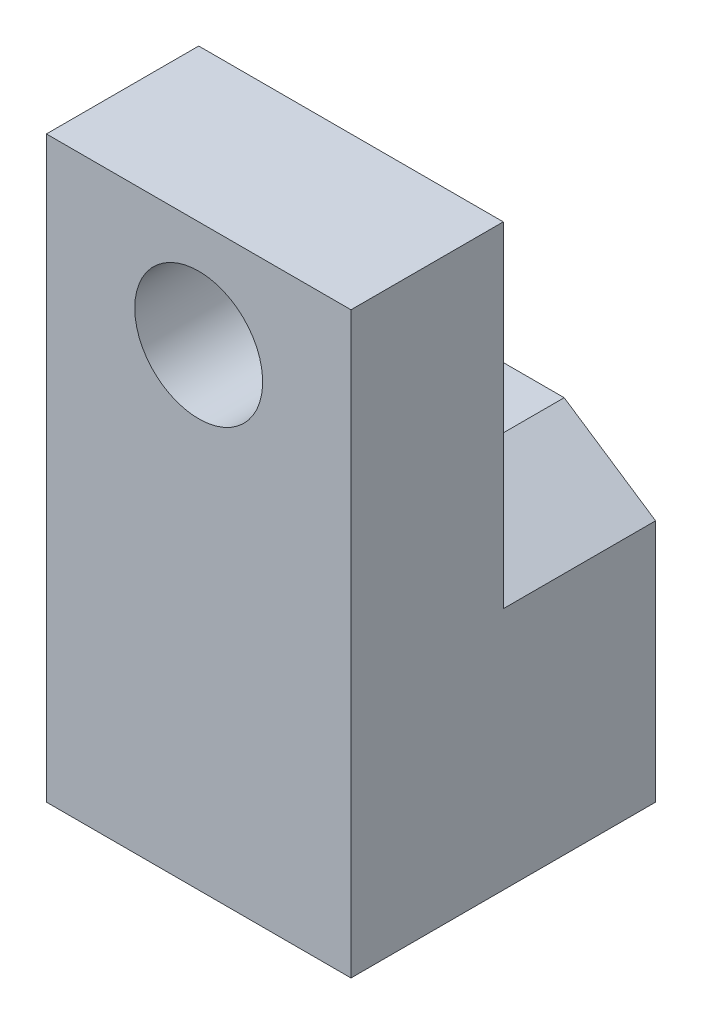
ISO-10303-21;
HEADER;
FILE_DESCRIPTION(('STEP AP214'),'2;1');
FILE_NAME('part.step','',(''),(''),'','','');
FILE_SCHEMA(('AUTOMOTIVE_DESIGN { 1 0 10303 214 1 1 1 1 }'));
ENDSEC;
DATA;
#1=APPLICATION_CONTEXT('core data for automotive mechanical design processes');
#2=APPLICATION_PROTOCOL_DEFINITION('international standard','automotive_design',2000,#1);
#3=PRODUCT_CONTEXT('',#1,'mechanical');
#4=PRODUCT('Part','Part','',(#3));
#5=PRODUCT_RELATED_PRODUCT_CATEGORY('part','',(#4));
#6=PRODUCT_DEFINITION_FORMATION('','',#4);
#7=PRODUCT_DEFINITION_CONTEXT('part definition',#1,'design');
#8=PRODUCT_DEFINITION('design','',#6,#7);
#9=PRODUCT_DEFINITION_SHAPE('','',#8);
#10=(LENGTH_UNIT() NAMED_UNIT(*) SI_UNIT(.MILLI.,.METRE.));
#11=(NAMED_UNIT(*) PLANE_ANGLE_UNIT() SI_UNIT($,.RADIAN.));
#12=(NAMED_UNIT(*) SI_UNIT($,.STERADIAN.) SOLID_ANGLE_UNIT());
#13=UNCERTAINTY_MEASURE_WITH_UNIT(LENGTH_MEASURE(1.E-05),#10,'distance_accuracy_value','');
#14=(GEOMETRIC_REPRESENTATION_CONTEXT(3) GLOBAL_UNCERTAINTY_ASSIGNED_CONTEXT((#13)) GLOBAL_UNIT_ASSIGNED_CONTEXT((#10,
#11,#12)) REPRESENTATION_CONTEXT('',''));
#15=CARTESIAN_POINT('',(0.,0.,0.));
#16=DIRECTION('',(0.,0.,1.));
#17=DIRECTION('',(1.,0.,0.));
#18=AXIS2_PLACEMENT_3D('',#15,#16,#17);
#19=CARTESIAN_POINT('',(-5.,9.5,10.));
#20=DIRECTION('',(0.,-1.,0.));
#21=DIRECTION('',(0.,0.,-1.));
#22=AXIS2_PLACEMENT_3D('',#19,#20,#21);
#23=PLANE('',#22);
#24=DIRECTION('',(1.,0.,0.));
#25=VECTOR('',#24,1.);
#26=CARTESIAN_POINT('',(0.,9.5,5.));
#27=LINE('',#26,#25);
#28=CARTESIAN_POINT('',(-5.,9.5,5.));
#29=VERTEX_POINT('',#28);
#30=CARTESIAN_POINT('',(5.,9.5,5.));
#31=VERTEX_POINT('',#30);
#32=EDGE_CURVE('E152',#29,#31,#27,.T.);
#33=ORIENTED_EDGE('',*,*,#32,.F.);
#34=DIRECTION('',(0.,0.,-1.));
#35=VECTOR('',#34,1.);
#36=CARTESIAN_POINT('',(-5.,9.5,10.));
#37=LINE('',#36,#35);
#38=CARTESIAN_POINT('',(-5.,9.5,10.));
#39=VERTEX_POINT('',#38);
#40=EDGE_CURVE('E52',#39,#29,#37,.T.);
#41=ORIENTED_EDGE('',*,*,#40,.F.);
#42=DIRECTION('',(-1.,0.,0.));
#43=VECTOR('',#42,1.);
#44=CARTESIAN_POINT('',(-5.,9.5,10.));
#45=LINE('',#44,#43);
#46=CARTESIAN_POINT('',(5.,9.5,10.));
#47=VERTEX_POINT('',#46);
#48=EDGE_CURVE('E226',#47,#39,#45,.T.);
#49=ORIENTED_EDGE('',*,*,#48,.F.);
#50=DIRECTION('',(0.,0.,-1.));
#51=VECTOR('',#50,1.);
#52=CARTESIAN_POINT('',(5.,9.5,10.));
#53=LINE('',#52,#51);
#54=EDGE_CURVE('E11',#47,#31,#53,.T.);
#55=ORIENTED_EDGE('',*,*,#54,.T.);
#56=EDGE_LOOP('',(#33,#41,#49,#55));
#57=FACE_BOUND('',#56,.T.);
#58=ADVANCED_FACE('F43',(#57),#23,.F.);
#59=CARTESIAN_POINT('',(-5.,9.5,10.));
#60=DIRECTION('',(1.,0.,0.));
#61=DIRECTION('',(0.,1.,0.));
#62=AXIS2_PLACEMENT_3D('',#59,#60,#61);
#63=PLANE('',#62);
#64=DIRECTION('',(0.,0.,-1.));
#65=VECTOR('',#64,1.);
#66=CARTESIAN_POINT('',(-5.,-1.5,5.));
#67=LINE('',#66,#65);
#68=CARTESIAN_POINT('',(-5.,-1.5,5.));
#69=VERTEX_POINT('',#68);
#70=CARTESIAN_POINT('',(-5.,-1.5,0.));
#71=VERTEX_POINT('',#70);
#72=EDGE_CURVE('E209',#69,#71,#67,.T.);
#73=ORIENTED_EDGE('',*,*,#72,.T.);
#74=DIRECTION('',(0.,-1.,0.));
#75=VECTOR('',#74,1.);
#76=CARTESIAN_POINT('',(-5.,9.5,0.));
#77=LINE('',#76,#75);
#78=CARTESIAN_POINT('',(-5.,-9.5,0.));
#79=VERTEX_POINT('',#78);
#80=EDGE_CURVE('E189',#71,#79,#77,.T.);
#81=ORIENTED_EDGE('',*,*,#80,.T.);
#82=DIRECTION('',(0.,0.,-1.));
#83=VECTOR('',#82,1.);
#84=CARTESIAN_POINT('',(-5.,-9.5,10.));
#85=LINE('',#84,#83);
#86=CARTESIAN_POINT('',(-5.,-9.5,10.));
#87=VERTEX_POINT('',#86);
#88=EDGE_CURVE('E183',#87,#79,#85,.T.);
#89=ORIENTED_EDGE('',*,*,#88,.F.);
#90=DIRECTION('',(0.,-1.,0.));
#91=VECTOR('',#90,1.);
#92=CARTESIAN_POINT('',(-5.,9.5,10.));
#93=LINE('',#92,#91);
#94=EDGE_CURVE('E223',#39,#87,#93,.T.);
#95=ORIENTED_EDGE('',*,*,#94,.F.);
#96=ORIENTED_EDGE('',*,*,#40,.T.);
#97=DIRECTION('',(0.,1.,0.));
#98=VECTOR('',#97,1.);
#99=CARTESIAN_POINT('',(-5.,0.,5.));
#100=LINE('',#99,#98);
#101=EDGE_CURVE('E157',#69,#29,#100,.T.);
#102=ORIENTED_EDGE('',*,*,#101,.F.);
#103=EDGE_LOOP('',(#73,#81,#89,#95,#96,#102));
#104=FACE_BOUND('',#103,.T.);
#105=ADVANCED_FACE('F222',(#104),#63,.F.);
#106=CARTESIAN_POINT('',(0.,0.,0.));
#107=DIRECTION('',(0.,0.,1.));
#108=DIRECTION('',(1.,0.,0.));
#109=AXIS2_PLACEMENT_3D('',#106,#107,#108);
#110=PLANE('',#109);
#111=DIRECTION('',(0.832050294337844,0.554700196225229,0.));
#112=VECTOR('',#111,1.);
#113=CARTESIAN_POINT('',(-0.846153846153845,1.26923076923077,0.));
#114=LINE('',#113,#112);
#115=CARTESIAN_POINT('',(-2.,0.499999999999999,0.));
#116=VERTEX_POINT('',#115);
#117=EDGE_CURVE('E164',#71,#116,#114,.T.);
#118=ORIENTED_EDGE('',*,*,#117,.T.);
#119=DIRECTION('',(-1.,0.,0.));
#120=VECTOR('',#119,1.);
#121=CARTESIAN_POINT('',(0.,0.499999999999998,0.));
#122=LINE('',#121,#120);
#123=CARTESIAN_POINT('',(2.,0.499999999999998,0.));
#124=VERTEX_POINT('',#123);
#125=EDGE_CURVE('E360',#124,#116,#122,.T.);
#126=ORIENTED_EDGE('',*,*,#125,.F.);
#127=DIRECTION('',(-0.832050294337844,0.554700196225229,0.));
#128=VECTOR('',#127,1.);
#129=CARTESIAN_POINT('',(0.846153846153844,1.26923076923077,0.));
#130=LINE('',#129,#128);
#131=CARTESIAN_POINT('',(5.,-1.5,0.));
#132=VERTEX_POINT('',#131);
#133=EDGE_CURVE('E129',#132,#124,#130,.T.);
#134=ORIENTED_EDGE('',*,*,#133,.F.);
#135=DIRECTION('',(0.,1.,0.));
#136=VECTOR('',#135,1.);
#137=CARTESIAN_POINT('',(5.,9.5,0.));
#138=LINE('',#137,#136);
#139=CARTESIAN_POINT('',(5.,-9.5,0.));
#140=VERTEX_POINT('',#139);
#141=EDGE_CURVE('E193',#140,#132,#138,.T.);
#142=ORIENTED_EDGE('',*,*,#141,.F.);
#143=DIRECTION('',(1.,0.,0.));
#144=VECTOR('',#143,1.);
#145=CARTESIAN_POINT('',(-5.,-9.5,0.));
#146=LINE('',#145,#144);
#147=EDGE_CURVE('E177',#79,#140,#146,.T.);
#148=ORIENTED_EDGE('',*,*,#147,.F.);
#149=ORIENTED_EDGE('',*,*,#80,.F.);
#150=EDGE_LOOP('',(#118,#126,#134,#142,#148,#149));
#151=FACE_BOUND('',#150,.T.);
#152=ADVANCED_FACE('F200',(#151),#110,.F.);
#153=CARTESIAN_POINT('',(0.,6.,10.));
#154=DIRECTION('',(0.,0.,-1.));
#155=DIRECTION('',(-1.,0.,0.));
#156=AXIS2_PLACEMENT_3D('',#153,#154,#155);
#157=CYLINDRICAL_SURFACE('',#156,2.1);
#158=CARTESIAN_POINT('',(0.,6.,10.));
#159=DIRECTION('',(0.,0.,-1.));
#160=DIRECTION('',(-1.,0.,0.));
#161=AXIS2_PLACEMENT_3D('',#158,#159,#160);
#162=CIRCLE('',#161,2.1);
#163=CARTESIAN_POINT('',(-2.1,6.,10.));
#164=VERTEX_POINT('',#163);
#165=EDGE_CURVE('E203',#164,#164,#162,.T.);
#166=ORIENTED_EDGE('',*,*,#165,.F.);
#167=EDGE_LOOP('',(#166));
#168=FACE_BOUND('',#167,.T.);
#169=CARTESIAN_POINT('',(0.,6.,5.));
#170=DIRECTION('',(0.,0.,-1.));
#171=DIRECTION('',(-1.,0.,0.));
#172=AXIS2_PLACEMENT_3D('',#169,#170,#171);
#173=CIRCLE('',#172,2.1);
#174=CARTESIAN_POINT('',(-2.1,6.,5.));
#175=VERTEX_POINT('',#174);
#176=EDGE_CURVE('E160',#175,#175,#173,.F.);
#177=ORIENTED_EDGE('',*,*,#176,.F.);
#178=EDGE_LOOP('',(#177));
#179=FACE_BOUND('',#178,.T.);
#180=ADVANCED_FACE('F259',(#168,#179),#157,.F.);
#181=CARTESIAN_POINT('',(5.,9.5,10.));
#182=DIRECTION('',(-1.,0.,0.));
#183=DIRECTION('',(0.,-1.,0.));
#184=AXIS2_PLACEMENT_3D('',#181,#182,#183);
#185=PLANE('',#184);
#186=ORIENTED_EDGE('',*,*,#141,.T.);
#187=DIRECTION('',(0.,0.,-1.));
#188=VECTOR('',#187,1.);
#189=CARTESIAN_POINT('',(5.,-1.5,5.));
#190=LINE('',#189,#188);
#191=CARTESIAN_POINT('',(5.,-1.5,5.));
#192=VERTEX_POINT('',#191);
#193=EDGE_CURVE('E66',#192,#132,#190,.T.);
#194=ORIENTED_EDGE('',*,*,#193,.F.);
#195=DIRECTION('',(0.,-1.,0.));
#196=VECTOR('',#195,1.);
#197=CARTESIAN_POINT('',(5.,0.,5.));
#198=LINE('',#197,#196);
#199=EDGE_CURVE('E150',#31,#192,#198,.T.);
#200=ORIENTED_EDGE('',*,*,#199,.F.);
#201=ORIENTED_EDGE('',*,*,#54,.F.);
#202=DIRECTION('',(0.,1.,0.));
#203=VECTOR('',#202,1.);
#204=CARTESIAN_POINT('',(5.,9.5,10.));
#205=LINE('',#204,#203);
#206=CARTESIAN_POINT('',(5.,-9.5,10.));
#207=VERTEX_POINT('',#206);
#208=EDGE_CURVE('E188',#207,#47,#205,.T.);
#209=ORIENTED_EDGE('',*,*,#208,.F.);
#210=DIRECTION('',(0.,0.,-1.));
#211=VECTOR('',#210,1.);
#212=CARTESIAN_POINT('',(5.,-9.5,10.));
#213=LINE('',#212,#211);
#214=EDGE_CURVE('E180',#207,#140,#213,.T.);
#215=ORIENTED_EDGE('',*,*,#214,.T.);
#216=EDGE_LOOP('',(#186,#194,#200,#201,#209,#215));
#217=FACE_BOUND('',#216,.T.);
#218=ADVANCED_FACE('F45',(#217),#185,.F.);
#219=CARTESIAN_POINT('',(-5.,-9.5,10.));
#220=DIRECTION('',(0.,1.,0.));
#221=DIRECTION('',(0.,0.,1.));
#222=AXIS2_PLACEMENT_3D('',#219,#220,#221);
#223=PLANE('',#222);
#224=CARTESIAN_POINT('',(0.,-9.5,5.));
#225=DIRECTION('',(0.,-1.,0.));
#226=DIRECTION('',(0.,0.,-1.));
#227=AXIS2_PLACEMENT_3D('',#224,#225,#226);
#228=CIRCLE('',#227,1.5);
#229=CARTESIAN_POINT('',(0.,-9.5,3.5));
#230=VERTEX_POINT('',#229);
#231=EDGE_CURVE('E137',#230,#230,#228,.T.);
#232=ORIENTED_EDGE('',*,*,#231,.F.);
#233=EDGE_LOOP('',(#232));
#234=FACE_BOUND('',#233,.T.);
#235=ORIENTED_EDGE('',*,*,#147,.T.);
#236=ORIENTED_EDGE('',*,*,#214,.F.);
#237=DIRECTION('',(1.,0.,0.));
#238=VECTOR('',#237,1.);
#239=CARTESIAN_POINT('',(-5.,-9.5,10.));
#240=LINE('',#239,#238);
#241=EDGE_CURVE('E197',#87,#207,#240,.T.);
#242=ORIENTED_EDGE('',*,*,#241,.F.);
#243=ORIENTED_EDGE('',*,*,#88,.T.);
#244=EDGE_LOOP('',(#235,#236,#242,#243));
#245=FACE_BOUND('',#244,.T.);
#246=ADVANCED_FACE('F169',(#234,#245),#223,.F.);
#247=CARTESIAN_POINT('',(0.,0.,10.));
#248=DIRECTION('',(0.,0.,1.));
#249=DIRECTION('',(1.,0.,0.));
#250=AXIS2_PLACEMENT_3D('',#247,#248,#249);
#251=PLANE('',#250);
#252=ORIENTED_EDGE('',*,*,#165,.T.);
#253=EDGE_LOOP('',(#252));
#254=FACE_BOUND('',#253,.T.);
#255=ORIENTED_EDGE('',*,*,#208,.T.);
#256=ORIENTED_EDGE('',*,*,#48,.T.);
#257=ORIENTED_EDGE('',*,*,#94,.T.);
#258=ORIENTED_EDGE('',*,*,#241,.T.);
#259=EDGE_LOOP('',(#255,#256,#257,#258));
#260=FACE_BOUND('',#259,.T.);
#261=ADVANCED_FACE('F172',(#254,#260),#251,.T.);
#262=CARTESIAN_POINT('',(-0.846153846153845,1.26923076923077,5.));
#263=DIRECTION('',(-0.554700196225229,0.832050294337844,0.));
#264=DIRECTION('',(-0.832050294337844,-0.554700196225229,0.));
#265=AXIS2_PLACEMENT_3D('',#262,#263,#264);
#266=PLANE('',#265);
#267=ORIENTED_EDGE('',*,*,#117,.F.);
#268=ORIENTED_EDGE('',*,*,#72,.F.);
#269=DIRECTION('',(0.832050294337844,0.554700196225229,0.));
#270=VECTOR('',#269,1.);
#271=CARTESIAN_POINT('',(-0.846153846153845,1.26923076923077,5.));
#272=LINE('',#271,#270);
#273=CARTESIAN_POINT('',(-2.,0.499999999999999,5.));
#274=VERTEX_POINT('',#273);
#275=EDGE_CURVE('E142',#69,#274,#272,.T.);
#276=ORIENTED_EDGE('',*,*,#275,.T.);
#277=DIRECTION('',(0.,0.,-1.));
#278=VECTOR('',#277,1.);
#279=CARTESIAN_POINT('',(-2.,0.499999999999999,5.));
#280=LINE('',#279,#278);
#281=EDGE_CURVE('E232',#274,#116,#280,.T.);
#282=ORIENTED_EDGE('',*,*,#281,.T.);
#283=EDGE_LOOP('',(#267,#268,#276,#282));
#284=FACE_BOUND('',#283,.T.);
#285=ADVANCED_FACE('F243',(#284),#266,.T.);
#286=CARTESIAN_POINT('',(0.,0.499999999999998,5.));
#287=DIRECTION('',(0.,-1.,0.));
#288=DIRECTION('',(1.,0.,0.));
#289=AXIS2_PLACEMENT_3D('',#286,#287,#288);
#290=PLANE('',#289);
#291=DIRECTION('',(-1.,0.,0.));
#292=VECTOR('',#291,1.);
#293=CARTESIAN_POINT('',(0.,0.499999999999998,5.));
#294=LINE('',#293,#292);
#295=CARTESIAN_POINT('',(-1.5,0.499999999999999,5.));
#296=VERTEX_POINT('',#295);
#297=EDGE_CURVE('E120',#296,#274,#294,.T.);
#298=ORIENTED_EDGE('',*,*,#297,.F.);
#299=CARTESIAN_POINT('',(0.,0.499999999999999,5.));
#300=DIRECTION('',(0.,-1.,0.));
#301=DIRECTION('',(0.,0.,-1.));
#302=AXIS2_PLACEMENT_3D('',#299,#300,#301);
#303=CIRCLE('',#302,1.5);
#304=CARTESIAN_POINT('',(1.5,0.499999999999999,5.));
#305=VERTEX_POINT('',#304);
#306=EDGE_CURVE('E126',#296,#305,#303,.T.);
#307=ORIENTED_EDGE('',*,*,#306,.T.);
#308=CARTESIAN_POINT('',(2.,0.499999999999998,5.));
#309=VERTEX_POINT('',#308);
#310=EDGE_CURVE('E119',#309,#305,#294,.T.);
#311=ORIENTED_EDGE('',*,*,#310,.F.);
#312=DIRECTION('',(0.,0.,-1.));
#313=VECTOR('',#312,1.);
#314=CARTESIAN_POINT('',(2.,0.499999999999998,5.));
#315=LINE('',#314,#313);
#316=EDGE_CURVE('E229',#309,#124,#315,.T.);
#317=ORIENTED_EDGE('',*,*,#316,.T.);
#318=ORIENTED_EDGE('',*,*,#125,.T.);
#319=ORIENTED_EDGE('',*,*,#281,.F.);
#320=EDGE_LOOP('',(#298,#307,#311,#317,#318,#319));
#321=FACE_BOUND('',#320,.T.);
#322=ADVANCED_FACE('F133',(#321),#290,.F.);
#323=CARTESIAN_POINT('',(0.846153846153844,1.26923076923077,5.));
#324=DIRECTION('',(-0.554700196225229,-0.832050294337844,0.));
#325=DIRECTION('',(0.832050294337844,-0.554700196225229,0.));
#326=AXIS2_PLACEMENT_3D('',#323,#324,#325);
#327=PLANE('',#326);
#328=ORIENTED_EDGE('',*,*,#133,.T.);
#329=ORIENTED_EDGE('',*,*,#316,.F.);
#330=DIRECTION('',(-0.832050294337844,0.554700196225229,0.));
#331=VECTOR('',#330,1.);
#332=CARTESIAN_POINT('',(0.846153846153844,1.26923076923077,5.));
#333=LINE('',#332,#331);
#334=EDGE_CURVE('E140',#192,#309,#333,.T.);
#335=ORIENTED_EDGE('',*,*,#334,.F.);
#336=ORIENTED_EDGE('',*,*,#193,.T.);
#337=EDGE_LOOP('',(#328,#329,#335,#336));
#338=FACE_BOUND('',#337,.T.);
#339=ADVANCED_FACE('F270',(#338),#327,.F.);
#340=CARTESIAN_POINT('',(0.,0.,5.));
#341=DIRECTION('',(0.,0.,-1.));
#342=DIRECTION('',(-1.,0.,0.));
#343=AXIS2_PLACEMENT_3D('',#340,#341,#342);
#344=PLANE('',#343);
#345=ORIENTED_EDGE('',*,*,#176,.T.);
#346=EDGE_LOOP('',(#345));
#347=FACE_BOUND('',#346,.T.);
#348=ORIENTED_EDGE('',*,*,#101,.T.);
#349=ORIENTED_EDGE('',*,*,#32,.T.);
#350=ORIENTED_EDGE('',*,*,#199,.T.);
#351=ORIENTED_EDGE('',*,*,#334,.T.);
#352=ORIENTED_EDGE('',*,*,#310,.T.);
#353=EDGE_CURVE('E114',#305,#296,#294,.T.);
#354=ORIENTED_EDGE('',*,*,#353,.T.);
#355=ORIENTED_EDGE('',*,*,#297,.T.);
#356=ORIENTED_EDGE('',*,*,#275,.F.);
#357=EDGE_LOOP('',(#348,#349,#350,#351,#352,#354,#355,#356));
#358=FACE_BOUND('',#357,.T.);
#359=ADVANCED_FACE('F138',(#347,#358),#344,.T.);
#360=CARTESIAN_POINT('',(0.,0.499999999999999,5.));
#361=DIRECTION('',(0.,-1.,0.));
#362=DIRECTION('',(0.,0.,-1.));
#363=AXIS2_PLACEMENT_3D('',#360,#361,#362);
#364=CYLINDRICAL_SURFACE('',#363,1.5);
#365=EDGE_CURVE('E58',#305,#296,#303,.T.);
#366=ORIENTED_EDGE('',*,*,#365,.F.);
#367=ORIENTED_EDGE('',*,*,#306,.F.);
#368=EDGE_LOOP('',(#366,#367));
#369=FACE_BOUND('',#368,.T.);
#370=ORIENTED_EDGE('',*,*,#231,.T.);
#371=EDGE_LOOP('',(#370));
#372=FACE_BOUND('',#371,.T.);
#373=ADVANCED_FACE('F124',(#369,#372),#364,.F.);
#374=CARTESIAN_POINT('',(0.,0.499999999999999,5.));
#375=DIRECTION('',(0.,-1.,0.));
#376=DIRECTION('',(0.,0.,-1.));
#377=AXIS2_PLACEMENT_3D('',#374,#375,#376);
#378=PLANE('',#377);
#379=ORIENTED_EDGE('',*,*,#365,.T.);
#380=ORIENTED_EDGE('',*,*,#353,.F.);
#381=EDGE_LOOP('',(#379,#380));
#382=FACE_BOUND('',#381,.T.);
#383=ADVANCED_FACE('F115',(#382),#378,.T.);
#384=CLOSED_SHELL('',(#58,#105,#152,#180,#218,#246,#261,#285,#322,#339,#359,#373,#383));
#385=MANIFOLD_SOLID_BREP('B2',#384);
#386=ADVANCED_BREP_SHAPE_REPRESENTATION('',(#18,#385),#14);
#387=SHAPE_DEFINITION_REPRESENTATION(#9,#386);
ENDSEC;
END-ISO-10303-21;
